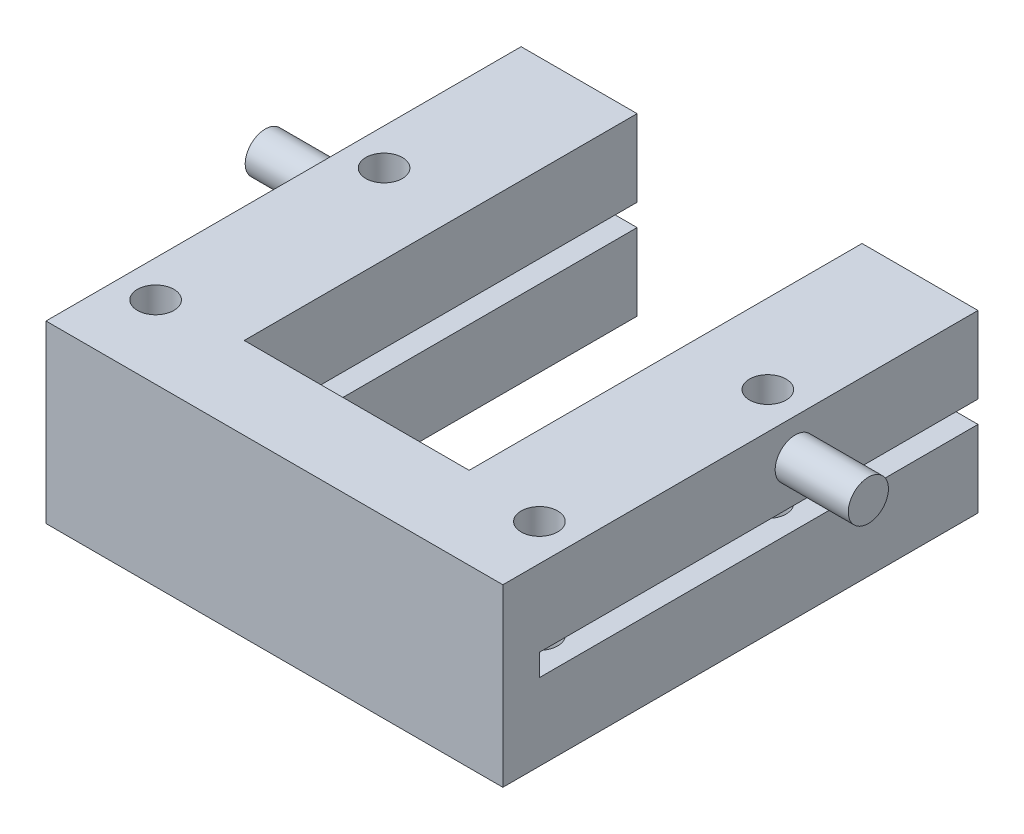
ISO-10303-21;
HEADER;
FILE_DESCRIPTION(('STEP AP214'),'2;1');
FILE_NAME('part.step','',(''),(''),'','','');
FILE_SCHEMA(('AUTOMOTIVE_DESIGN { 1 0 10303 214 1 1 1 1 }'));
ENDSEC;
DATA;
#1=APPLICATION_CONTEXT('core data for automotive mechanical design processes');
#2=APPLICATION_PROTOCOL_DEFINITION('international standard','automotive_design',2000,#1);
#3=PRODUCT_CONTEXT('',#1,'mechanical');
#4=PRODUCT('Part','Part','',(#3));
#5=PRODUCT_RELATED_PRODUCT_CATEGORY('part','',(#4));
#6=PRODUCT_DEFINITION_FORMATION('','',#4);
#7=PRODUCT_DEFINITION_CONTEXT('part definition',#1,'design');
#8=PRODUCT_DEFINITION('design','',#6,#7);
#9=PRODUCT_DEFINITION_SHAPE('','',#8);
#10=(LENGTH_UNIT() NAMED_UNIT(*) SI_UNIT(.MILLI.,.METRE.));
#11=(NAMED_UNIT(*) PLANE_ANGLE_UNIT() SI_UNIT($,.RADIAN.));
#12=(NAMED_UNIT(*) SI_UNIT($,.STERADIAN.) SOLID_ANGLE_UNIT());
#13=UNCERTAINTY_MEASURE_WITH_UNIT(LENGTH_MEASURE(1.E-05),#10,'distance_accuracy_value','');
#14=(GEOMETRIC_REPRESENTATION_CONTEXT(3) GLOBAL_UNCERTAINTY_ASSIGNED_CONTEXT((#13)) GLOBAL_UNIT_ASSIGNED_CONTEXT((#10,
#11,#12)) REPRESENTATION_CONTEXT('',''));
#15=CARTESIAN_POINT('',(0.,0.,0.));
#16=DIRECTION('',(0.,0.,1.));
#17=DIRECTION('',(1.,0.,0.));
#18=AXIS2_PLACEMENT_3D('',#15,#16,#17);
#19=CARTESIAN_POINT('',(4.25,4.2,-2.5));
#20=DIRECTION('',(0.,0.,1.));
#21=DIRECTION('',(1.,0.,0.));
#22=AXIS2_PLACEMENT_3D('',#19,#20,#21);
#23=PLANE('',#22);
#24=DIRECTION('',(0.,1.,0.));
#25=VECTOR('',#24,1.);
#26=CARTESIAN_POINT('',(18.6536328938881,4.2,-2.5));
#27=LINE('',#26,#25);
#28=CARTESIAN_POINT('',(18.6536328938881,0.,-2.5));
#29=VERTEX_POINT('',#28);
#30=CARTESIAN_POINT('',(18.6536328938881,4.2,-2.5));
#31=VERTEX_POINT('',#30);
#32=EDGE_CURVE('E221',#29,#31,#27,.T.);
#33=ORIENTED_EDGE('',*,*,#32,.F.);
#34=DIRECTION('',(1.,0.,0.));
#35=VECTOR('',#34,1.);
#36=CARTESIAN_POINT('',(25.,0.,-2.5));
#37=LINE('',#36,#35);
#38=CARTESIAN_POINT('',(6.34636710611189,0.,-2.5));
#39=VERTEX_POINT('',#38);
#40=EDGE_CURVE('E182',#39,#29,#37,.T.);
#41=ORIENTED_EDGE('',*,*,#40,.F.);
#42=DIRECTION('',(0.,-1.,0.));
#43=VECTOR('',#42,1.);
#44=CARTESIAN_POINT('',(6.34636710611189,4.2,-2.5));
#45=LINE('',#44,#43);
#46=CARTESIAN_POINT('',(6.34636710611189,4.2,-2.5));
#47=VERTEX_POINT('',#46);
#48=EDGE_CURVE('E218',#47,#39,#45,.T.);
#49=ORIENTED_EDGE('',*,*,#48,.F.);
#50=DIRECTION('',(-1.,0.,0.));
#51=VECTOR('',#50,1.);
#52=CARTESIAN_POINT('',(4.25,4.2,-2.5));
#53=LINE('',#52,#51);
#54=EDGE_CURVE('E323',#31,#47,#53,.T.);
#55=ORIENTED_EDGE('',*,*,#54,.F.);
#56=EDGE_LOOP('',(#33,#41,#49,#55));
#57=FACE_BOUND('',#56,.T.);
#58=ADVANCED_FACE('F39',(#57),#23,.F.);
#59=CARTESIAN_POINT('',(2.,4.2,-2.));
#60=DIRECTION('',(0.,-1.,0.));
#61=DIRECTION('',(0.,0.,-1.));
#62=AXIS2_PLACEMENT_3D('',#59,#60,#61);
#63=CYLINDRICAL_SURFACE('',#62,1.);
#64=CARTESIAN_POINT('',(2.,0.,-2.));
#65=DIRECTION('',(0.,-1.,0.));
#66=DIRECTION('',(0.,0.,-1.));
#67=AXIS2_PLACEMENT_3D('',#64,#65,#66);
#68=CIRCLE('',#67,1.);
#69=CARTESIAN_POINT('',(2.,0.,-3.));
#70=VERTEX_POINT('',#69);
#71=EDGE_CURVE('E257',#70,#70,#68,.T.);
#72=ORIENTED_EDGE('',*,*,#71,.T.);
#73=EDGE_LOOP('',(#72));
#74=FACE_BOUND('',#73,.T.);
#75=CARTESIAN_POINT('',(2.,4.2,-2.));
#76=DIRECTION('',(0.,1.,0.));
#77=DIRECTION('',(0.,0.,1.));
#78=AXIS2_PLACEMENT_3D('',#75,#76,#77);
#79=CIRCLE('',#78,1.);
#80=CARTESIAN_POINT('',(2.,4.2,-1.));
#81=VERTEX_POINT('',#80);
#82=EDGE_CURVE('E312',#81,#81,#79,.T.);
#83=ORIENTED_EDGE('',*,*,#82,.T.);
#84=EDGE_LOOP('',(#83));
#85=FACE_BOUND('',#84,.T.);
#86=ADVANCED_FACE('F360',(#74,#85),#63,.F.);
#87=CARTESIAN_POINT('',(23.,4.2,-2.));
#88=DIRECTION('',(0.,-1.,0.));
#89=DIRECTION('',(0.,0.,-1.));
#90=AXIS2_PLACEMENT_3D('',#87,#88,#89);
#91=CYLINDRICAL_SURFACE('',#90,0.999999999999998);
#92=CARTESIAN_POINT('',(23.,0.,-2.));
#93=DIRECTION('',(0.,-1.,0.));
#94=DIRECTION('',(0.,0.,-1.));
#95=AXIS2_PLACEMENT_3D('',#92,#93,#94);
#96=CIRCLE('',#95,0.999999999999998);
#97=CARTESIAN_POINT('',(23.,0.,-3.));
#98=VERTEX_POINT('',#97);
#99=EDGE_CURVE('E254',#98,#98,#96,.T.);
#100=ORIENTED_EDGE('',*,*,#99,.T.);
#101=EDGE_LOOP('',(#100));
#102=FACE_BOUND('',#101,.T.);
#103=CARTESIAN_POINT('',(23.,4.2,-2.));
#104=DIRECTION('',(0.,1.,0.));
#105=DIRECTION('',(0.,0.,-1.));
#106=AXIS2_PLACEMENT_3D('',#103,#104,#105);
#107=CIRCLE('',#106,0.999999999999998);
#108=CARTESIAN_POINT('',(23.,4.2,-3.));
#109=VERTEX_POINT('',#108);
#110=EDGE_CURVE('E309',#109,#109,#107,.T.);
#111=ORIENTED_EDGE('',*,*,#110,.T.);
#112=EDGE_LOOP('',(#111));
#113=FACE_BOUND('',#112,.T.);
#114=ADVANCED_FACE('F372',(#102,#113),#91,.F.);
#115=DIRECTION('',(0.,-1.,0.));
#116=VECTOR('',#115,1.);
#117=CARTESIAN_POINT('',(6.34636710611189,-5.4,-2.5));
#118=LINE('',#117,#116);
#119=CARTESIAN_POINT('',(6.34636710611189,-1.2,-2.5));
#120=VERTEX_POINT('',#119);
#121=CARTESIAN_POINT('',(6.34636710611189,-5.4,-2.5));
#122=VERTEX_POINT('',#121);
#123=EDGE_CURVE('E209',#120,#122,#118,.T.);
#124=ORIENTED_EDGE('',*,*,#123,.F.);
#125=DIRECTION('',(-1.,0.,0.));
#126=VECTOR('',#125,1.);
#127=CARTESIAN_POINT('',(25.,-1.2,-2.5));
#128=LINE('',#127,#126);
#129=CARTESIAN_POINT('',(18.6536328938881,-1.2,-2.5));
#130=VERTEX_POINT('',#129);
#131=EDGE_CURVE('E184',#130,#120,#128,.T.);
#132=ORIENTED_EDGE('',*,*,#131,.F.);
#133=DIRECTION('',(0.,1.,0.));
#134=VECTOR('',#133,1.);
#135=CARTESIAN_POINT('',(18.6536328938881,-5.4,-2.5));
#136=LINE('',#135,#134);
#137=CARTESIAN_POINT('',(18.6536328938881,-5.4,-2.5));
#138=VERTEX_POINT('',#137);
#139=EDGE_CURVE('E195',#138,#130,#136,.T.);
#140=ORIENTED_EDGE('',*,*,#139,.F.);
#141=DIRECTION('',(-1.,0.,0.));
#142=VECTOR('',#141,1.);
#143=CARTESIAN_POINT('',(4.25,-5.4,-2.5));
#144=LINE('',#143,#142);
#145=EDGE_CURVE('E285',#138,#122,#144,.T.);
#146=ORIENTED_EDGE('',*,*,#145,.T.);
#147=EDGE_LOOP('',(#124,#132,#140,#146));
#148=FACE_BOUND('',#147,.T.);
#149=ADVANCED_FACE('F368',(#148),#23,.F.);
#150=CARTESIAN_POINT('',(0.,4.2,0.));
#151=DIRECTION('',(1.,0.,0.));
#152=DIRECTION('',(0.,0.,-1.));
#153=AXIS2_PLACEMENT_3D('',#150,#151,#152);
#154=PLANE('',#153);
#155=DIRECTION('',(0.,0.,1.));
#156=VECTOR('',#155,1.);
#157=CARTESIAN_POINT('',(0.,0.,-49.0287834302828));
#158=LINE('',#157,#156);
#159=CARTESIAN_POINT('',(0.,0.,-24.));
#160=VERTEX_POINT('',#159);
#161=CARTESIAN_POINT('',(0.,0.,0.));
#162=VERTEX_POINT('',#161);
#163=EDGE_CURVE('E240',#160,#162,#158,.T.);
#164=ORIENTED_EDGE('',*,*,#163,.T.);
#165=DIRECTION('',(0.,1.,0.));
#166=VECTOR('',#165,1.);
#167=CARTESIAN_POINT('',(0.,0.,0.));
#168=LINE('',#167,#166);
#169=CARTESIAN_POINT('',(0.,-1.2,0.));
#170=VERTEX_POINT('',#169);
#171=EDGE_CURVE('E176',#170,#162,#168,.T.);
#172=ORIENTED_EDGE('',*,*,#171,.F.);
#173=DIRECTION('',(0.,0.,1.));
#174=VECTOR('',#173,1.);
#175=CARTESIAN_POINT('',(0.,-1.2,-49.0287834302828));
#176=LINE('',#175,#174);
#177=CARTESIAN_POINT('',(0.,-1.2,-24.));
#178=VERTEX_POINT('',#177);
#179=EDGE_CURVE('E165',#178,#170,#176,.T.);
#180=ORIENTED_EDGE('',*,*,#179,.F.);
#181=DIRECTION('',(0.,-1.,0.));
#182=VECTOR('',#181,1.);
#183=CARTESIAN_POINT('',(0.,4.2,-24.));
#184=LINE('',#183,#182);
#185=CARTESIAN_POINT('',(0.,-5.4,-24.));
#186=VERTEX_POINT('',#185);
#187=EDGE_CURVE('E327',#178,#186,#184,.T.);
#188=ORIENTED_EDGE('',*,*,#187,.T.);
#189=DIRECTION('',(0.,0.,1.));
#190=VECTOR('',#189,1.);
#191=CARTESIAN_POINT('',(0.,-5.4,0.));
#192=LINE('',#191,#190);
#193=CARTESIAN_POINT('',(0.,-5.4,2.));
#194=VERTEX_POINT('',#193);
#195=EDGE_CURVE('E278',#186,#194,#192,.T.);
#196=ORIENTED_EDGE('',*,*,#195,.T.);
#197=DIRECTION('',(0.,-1.,0.));
#198=VECTOR('',#197,1.);
#199=CARTESIAN_POINT('',(0.,4.2,2.));
#200=LINE('',#199,#198);
#201=CARTESIAN_POINT('',(0.,4.2,2.));
#202=VERTEX_POINT('',#201);
#203=EDGE_CURVE('E290',#202,#194,#200,.T.);
#204=ORIENTED_EDGE('',*,*,#203,.F.);
#205=DIRECTION('',(0.,0.,1.));
#206=VECTOR('',#205,1.);
#207=CARTESIAN_POINT('',(0.,4.2,0.));
#208=LINE('',#207,#206);
#209=CARTESIAN_POINT('',(0.,4.2,-24.));
#210=VERTEX_POINT('',#209);
#211=EDGE_CURVE('E318',#210,#202,#208,.T.);
#212=ORIENTED_EDGE('',*,*,#211,.F.);
#213=EDGE_CURVE('E328',#210,#160,#184,.T.);
#214=ORIENTED_EDGE('',*,*,#213,.T.);
#215=EDGE_LOOP('',(#164,#172,#180,#188,#196,#204,#212,#214));
#216=FACE_BOUND('',#215,.T.);
#217=CARTESIAN_POINT('',(0.,2.2,-14.));
#218=DIRECTION('',(-1.,0.,0.));
#219=DIRECTION('',(0.,0.,1.));
#220=AXIS2_PLACEMENT_3D('',#217,#218,#219);
#221=CIRCLE('',#220,1.1);
#222=CARTESIAN_POINT('',(0.,2.2,-12.9));
#223=VERTEX_POINT('',#222);
#224=EDGE_CURVE('E11',#223,#223,#221,.T.);
#225=ORIENTED_EDGE('',*,*,#224,.F.);
#226=EDGE_LOOP('',(#225));
#227=FACE_BOUND('',#226,.T.);
#228=ADVANCED_FACE('F41',(#216,#227),#154,.F.);
#229=CARTESIAN_POINT('',(25.,4.2,0.));
#230=DIRECTION('',(-1.,0.,0.));
#231=DIRECTION('',(0.,0.,1.));
#232=AXIS2_PLACEMENT_3D('',#229,#230,#231);
#233=PLANE('',#232);
#234=CARTESIAN_POINT('',(25.,2.2,-14.));
#235=DIRECTION('',(-1.,0.,0.));
#236=DIRECTION('',(0.,0.,1.));
#237=AXIS2_PLACEMENT_3D('',#234,#235,#236);
#238=CIRCLE('',#237,1.1);
#239=CARTESIAN_POINT('',(25.,2.2,-12.9));
#240=VERTEX_POINT('',#239);
#241=EDGE_CURVE('E297',#240,#240,#238,.T.);
#242=ORIENTED_EDGE('',*,*,#241,.T.);
#243=EDGE_LOOP('',(#242));
#244=FACE_BOUND('',#243,.T.);
#245=DIRECTION('',(0.,-1.,0.));
#246=VECTOR('',#245,1.);
#247=CARTESIAN_POINT('',(25.,0.,0.));
#248=LINE('',#247,#246);
#249=CARTESIAN_POINT('',(25.,0.,0.));
#250=VERTEX_POINT('',#249);
#251=CARTESIAN_POINT('',(25.,-1.2,0.));
#252=VERTEX_POINT('',#251);
#253=EDGE_CURVE('E159',#250,#252,#248,.T.);
#254=ORIENTED_EDGE('',*,*,#253,.F.);
#255=DIRECTION('',(0.,0.,1.));
#256=VECTOR('',#255,1.);
#257=CARTESIAN_POINT('',(25.,0.,-49.0287834302828));
#258=LINE('',#257,#256);
#259=CARTESIAN_POINT('',(25.,0.,-24.));
#260=VERTEX_POINT('',#259);
#261=EDGE_CURVE('E227',#260,#250,#258,.T.);
#262=ORIENTED_EDGE('',*,*,#261,.F.);
#263=DIRECTION('',(0.,-1.,0.));
#264=VECTOR('',#263,1.);
#265=CARTESIAN_POINT('',(25.,4.2,-24.));
#266=LINE('',#265,#264);
#267=CARTESIAN_POINT('',(25.,4.2,-24.));
#268=VERTEX_POINT('',#267);
#269=EDGE_CURVE('E48',#268,#260,#266,.T.);
#270=ORIENTED_EDGE('',*,*,#269,.F.);
#271=DIRECTION('',(0.,0.,-1.));
#272=VECTOR('',#271,1.);
#273=CARTESIAN_POINT('',(25.,4.2,0.));
#274=LINE('',#273,#272);
#275=CARTESIAN_POINT('',(25.,4.2,2.));
#276=VERTEX_POINT('',#275);
#277=EDGE_CURVE('E63',#276,#268,#274,.T.);
#278=ORIENTED_EDGE('',*,*,#277,.F.);
#279=DIRECTION('',(0.,1.,0.));
#280=VECTOR('',#279,1.);
#281=CARTESIAN_POINT('',(25.,4.2,2.));
#282=LINE('',#281,#280);
#283=CARTESIAN_POINT('',(25.,-5.4,2.));
#284=VERTEX_POINT('',#283);
#285=EDGE_CURVE('E292',#284,#276,#282,.T.);
#286=ORIENTED_EDGE('',*,*,#285,.F.);
#287=DIRECTION('',(0.,0.,-1.));
#288=VECTOR('',#287,1.);
#289=CARTESIAN_POINT('',(25.,-5.4,0.));
#290=LINE('',#289,#288);
#291=CARTESIAN_POINT('',(25.,-5.4,-24.));
#292=VERTEX_POINT('',#291);
#293=EDGE_CURVE('E281',#284,#292,#290,.T.);
#294=ORIENTED_EDGE('',*,*,#293,.T.);
#295=CARTESIAN_POINT('',(25.,-1.2,-24.));
#296=VERTEX_POINT('',#295);
#297=EDGE_CURVE('E161',#296,#292,#266,.T.);
#298=ORIENTED_EDGE('',*,*,#297,.F.);
#299=DIRECTION('',(0.,0.,1.));
#300=VECTOR('',#299,1.);
#301=CARTESIAN_POINT('',(25.,-1.2,-49.0287834302828));
#302=LINE('',#301,#300);
#303=EDGE_CURVE('E154',#296,#252,#302,.T.);
#304=ORIENTED_EDGE('',*,*,#303,.T.);
#305=EDGE_LOOP('',(#254,#262,#270,#278,#286,#294,#298,#304));
#306=FACE_BOUND('',#305,.T.);
#307=ADVANCED_FACE('F156',(#244,#306),#233,.F.);
#308=CARTESIAN_POINT('',(20.75,4.2,-24.));
#309=DIRECTION('',(0.,0.,1.));
#310=DIRECTION('',(1.,0.,0.));
#311=AXIS2_PLACEMENT_3D('',#308,#309,#310);
#312=PLANE('',#311);
#313=DIRECTION('',(-1.,0.,0.));
#314=VECTOR('',#313,1.);
#315=CARTESIAN_POINT('',(25.,0.,-24.));
#316=LINE('',#315,#314);
#317=CARTESIAN_POINT('',(18.6536328938881,0.,-24.));
#318=VERTEX_POINT('',#317);
#319=EDGE_CURVE('E243',#260,#318,#316,.T.);
#320=ORIENTED_EDGE('',*,*,#319,.T.);
#321=DIRECTION('',(0.,-1.,0.));
#322=VECTOR('',#321,1.);
#323=CARTESIAN_POINT('',(18.6536328938881,4.2,-24.));
#324=LINE('',#323,#322);
#325=CARTESIAN_POINT('',(18.6536328938881,4.2,-24.));
#326=VERTEX_POINT('',#325);
#327=EDGE_CURVE('E224',#326,#318,#324,.T.);
#328=ORIENTED_EDGE('',*,*,#327,.F.);
#329=DIRECTION('',(-1.,0.,0.));
#330=VECTOR('',#329,1.);
#331=CARTESIAN_POINT('',(20.75,4.2,-24.));
#332=LINE('',#331,#330);
#333=EDGE_CURVE('E321',#268,#326,#332,.T.);
#334=ORIENTED_EDGE('',*,*,#333,.F.);
#335=ORIENTED_EDGE('',*,*,#269,.T.);
#336=EDGE_LOOP('',(#320,#328,#334,#335));
#337=FACE_BOUND('',#336,.T.);
#338=ADVANCED_FACE('F414',(#337),#312,.F.);
#339=DIRECTION('',(1.,0.,0.));
#340=VECTOR('',#339,1.);
#341=CARTESIAN_POINT('',(25.,-1.2,-24.));
#342=LINE('',#341,#340);
#343=CARTESIAN_POINT('',(18.6536328938881,-1.2,-24.));
#344=VERTEX_POINT('',#343);
#345=EDGE_CURVE('E238',#344,#296,#342,.T.);
#346=ORIENTED_EDGE('',*,*,#345,.T.);
#347=ORIENTED_EDGE('',*,*,#297,.T.);
#348=DIRECTION('',(-1.,0.,0.));
#349=VECTOR('',#348,1.);
#350=CARTESIAN_POINT('',(20.75,-5.4,-24.));
#351=LINE('',#350,#349);
#352=CARTESIAN_POINT('',(18.6536328938881,-5.4,-24.));
#353=VERTEX_POINT('',#352);
#354=EDGE_CURVE('E283',#292,#353,#351,.T.);
#355=ORIENTED_EDGE('',*,*,#354,.T.);
#356=DIRECTION('',(0.,-1.,0.));
#357=VECTOR('',#356,1.);
#358=CARTESIAN_POINT('',(18.6536328938881,-5.4,-24.));
#359=LINE('',#358,#357);
#360=EDGE_CURVE('E189',#344,#353,#359,.T.);
#361=ORIENTED_EDGE('',*,*,#360,.F.);
#362=EDGE_LOOP('',(#346,#347,#355,#361));
#363=FACE_BOUND('',#362,.T.);
#364=ADVANCED_FACE('F434',(#363),#312,.F.);
#365=CARTESIAN_POINT('',(0.,4.2,-24.));
#366=DIRECTION('',(0.,0.,1.));
#367=DIRECTION('',(1.,0.,0.));
#368=AXIS2_PLACEMENT_3D('',#365,#366,#367);
#369=PLANE('',#368);
#370=CARTESIAN_POINT('',(6.34636710611189,0.,-24.));
#371=VERTEX_POINT('',#370);
#372=EDGE_CURVE('E164',#371,#160,#316,.T.);
#373=ORIENTED_EDGE('',*,*,#372,.T.);
#374=ORIENTED_EDGE('',*,*,#213,.F.);
#375=DIRECTION('',(-1.,0.,0.));
#376=VECTOR('',#375,1.);
#377=CARTESIAN_POINT('',(0.,4.2,-24.));
#378=LINE('',#377,#376);
#379=CARTESIAN_POINT('',(6.34636710611189,4.2,-24.));
#380=VERTEX_POINT('',#379);
#381=EDGE_CURVE('E56',#380,#210,#378,.T.);
#382=ORIENTED_EDGE('',*,*,#381,.F.);
#383=DIRECTION('',(0.,1.,0.));
#384=VECTOR('',#383,1.);
#385=CARTESIAN_POINT('',(6.34636710611189,4.2,-24.));
#386=LINE('',#385,#384);
#387=EDGE_CURVE('E212',#371,#380,#386,.T.);
#388=ORIENTED_EDGE('',*,*,#387,.F.);
#389=EDGE_LOOP('',(#373,#374,#382,#388));
#390=FACE_BOUND('',#389,.T.);
#391=ADVANCED_FACE('F427',(#390),#369,.F.);
#392=CARTESIAN_POINT('',(6.34636710611189,-1.2,-24.));
#393=VERTEX_POINT('',#392);
#394=EDGE_CURVE('E235',#178,#393,#342,.T.);
#395=ORIENTED_EDGE('',*,*,#394,.T.);
#396=DIRECTION('',(0.,1.,0.));
#397=VECTOR('',#396,1.);
#398=CARTESIAN_POINT('',(6.34636710611189,-5.4,-24.));
#399=LINE('',#398,#397);
#400=CARTESIAN_POINT('',(6.34636710611189,-5.4,-24.));
#401=VERTEX_POINT('',#400);
#402=EDGE_CURVE('E198',#401,#393,#399,.T.);
#403=ORIENTED_EDGE('',*,*,#402,.F.);
#404=DIRECTION('',(-1.,0.,0.));
#405=VECTOR('',#404,1.);
#406=CARTESIAN_POINT('',(0.,-5.4,-24.));
#407=LINE('',#406,#405);
#408=EDGE_CURVE('E287',#401,#186,#407,.T.);
#409=ORIENTED_EDGE('',*,*,#408,.T.);
#410=ORIENTED_EDGE('',*,*,#187,.F.);
#411=EDGE_LOOP('',(#395,#403,#409,#410));
#412=FACE_BOUND('',#411,.T.);
#413=ADVANCED_FACE('F361',(#412),#369,.F.);
#414=CARTESIAN_POINT('',(2.,4.2,-14.5));
#415=DIRECTION('',(0.,-1.,0.));
#416=DIRECTION('',(0.,0.,-1.));
#417=AXIS2_PLACEMENT_3D('',#414,#415,#416);
#418=CYLINDRICAL_SURFACE('',#417,1.);
#419=CARTESIAN_POINT('',(2.,4.2,-14.5));
#420=DIRECTION('',(0.,1.,0.));
#421=DIRECTION('',(0.,0.,1.));
#422=AXIS2_PLACEMENT_3D('',#419,#420,#421);
#423=CIRCLE('',#422,1.);
#424=CARTESIAN_POINT('',(2.,4.2,-13.5));
#425=VERTEX_POINT('',#424);
#426=EDGE_CURVE('E315',#425,#425,#423,.T.);
#427=ORIENTED_EDGE('',*,*,#426,.T.);
#428=EDGE_LOOP('',(#427));
#429=FACE_BOUND('',#428,.T.);
#430=CARTESIAN_POINT('',(2.,0.,-14.5));
#431=DIRECTION('',(0.,-1.,0.));
#432=DIRECTION('',(0.,0.,-1.));
#433=AXIS2_PLACEMENT_3D('',#430,#431,#432);
#434=CIRCLE('',#433,1.);
#435=CARTESIAN_POINT('',(2.,0.,-15.5));
#436=VERTEX_POINT('',#435);
#437=EDGE_CURVE('E260',#436,#436,#434,.T.);
#438=ORIENTED_EDGE('',*,*,#437,.T.);
#439=EDGE_LOOP('',(#438));
#440=FACE_BOUND('',#439,.T.);
#441=ADVANCED_FACE('F350',(#429,#440),#418,.F.);
#442=CARTESIAN_POINT('',(2.,-5.4,-14.5));
#443=DIRECTION('',(0.,1.,0.));
#444=DIRECTION('',(0.,0.,1.));
#445=AXIS2_PLACEMENT_3D('',#442,#443,#444);
#446=CIRCLE('',#445,1.);
#447=CARTESIAN_POINT('',(2.,-5.4,-13.5));
#448=VERTEX_POINT('',#447);
#449=EDGE_CURVE('E275',#448,#448,#446,.T.);
#450=ORIENTED_EDGE('',*,*,#449,.F.);
#451=EDGE_LOOP('',(#450));
#452=FACE_BOUND('',#451,.T.);
#453=CARTESIAN_POINT('',(2.,-1.2,-14.5));
#454=DIRECTION('',(0.,1.,0.));
#455=DIRECTION('',(0.,0.,1.));
#456=AXIS2_PLACEMENT_3D('',#453,#454,#455);
#457=CIRCLE('',#456,1.);
#458=CARTESIAN_POINT('',(2.,-1.2,-13.5));
#459=VERTEX_POINT('',#458);
#460=EDGE_CURVE('E251',#459,#459,#457,.T.);
#461=ORIENTED_EDGE('',*,*,#460,.T.);
#462=EDGE_LOOP('',(#461));
#463=FACE_BOUND('',#462,.T.);
#464=ADVANCED_FACE('F347',(#452,#463),#418,.F.);
#465=CARTESIAN_POINT('',(2.,-1.2,-2.));
#466=DIRECTION('',(0.,1.,0.));
#467=DIRECTION('',(0.,0.,1.));
#468=AXIS2_PLACEMENT_3D('',#465,#466,#467);
#469=CIRCLE('',#468,1.);
#470=CARTESIAN_POINT('',(2.,-1.2,-1.));
#471=VERTEX_POINT('',#470);
#472=EDGE_CURVE('E248',#471,#471,#469,.T.);
#473=ORIENTED_EDGE('',*,*,#472,.T.);
#474=EDGE_LOOP('',(#473));
#475=FACE_BOUND('',#474,.T.);
#476=CARTESIAN_POINT('',(2.,-5.4,-2.));
#477=DIRECTION('',(0.,1.,0.));
#478=DIRECTION('',(0.,0.,1.));
#479=AXIS2_PLACEMENT_3D('',#476,#477,#478);
#480=CIRCLE('',#479,1.);
#481=CARTESIAN_POINT('',(2.,-5.4,-1.));
#482=VERTEX_POINT('',#481);
#483=EDGE_CURVE('E272',#482,#482,#480,.T.);
#484=ORIENTED_EDGE('',*,*,#483,.F.);
#485=EDGE_LOOP('',(#484));
#486=FACE_BOUND('',#485,.T.);
#487=ADVANCED_FACE('F349',(#475,#486),#63,.F.);
#488=CARTESIAN_POINT('',(23.,-1.2,-2.));
#489=DIRECTION('',(0.,1.,0.));
#490=DIRECTION('',(0.,0.,1.));
#491=AXIS2_PLACEMENT_3D('',#488,#489,#490);
#492=CIRCLE('',#491,0.999999999999998);
#493=CARTESIAN_POINT('',(23.,-1.2,-1.));
#494=VERTEX_POINT('',#493);
#495=EDGE_CURVE('E245',#494,#494,#492,.T.);
#496=ORIENTED_EDGE('',*,*,#495,.T.);
#497=EDGE_LOOP('',(#496));
#498=FACE_BOUND('',#497,.T.);
#499=CARTESIAN_POINT('',(23.,-5.4,-2.));
#500=DIRECTION('',(0.,1.,0.));
#501=DIRECTION('',(0.,0.,-1.));
#502=AXIS2_PLACEMENT_3D('',#499,#500,#501);
#503=CIRCLE('',#502,0.999999999999998);
#504=CARTESIAN_POINT('',(23.,-5.4,-3.));
#505=VERTEX_POINT('',#504);
#506=EDGE_CURVE('E269',#505,#505,#503,.T.);
#507=ORIENTED_EDGE('',*,*,#506,.F.);
#508=EDGE_LOOP('',(#507));
#509=FACE_BOUND('',#508,.T.);
#510=ADVANCED_FACE('F357',(#498,#509),#91,.F.);
#511=CARTESIAN_POINT('',(23.,4.2,-14.5));
#512=DIRECTION('',(0.,-1.,0.));
#513=DIRECTION('',(0.,0.,-1.));
#514=AXIS2_PLACEMENT_3D('',#511,#512,#513);
#515=CYLINDRICAL_SURFACE('',#514,0.999999999999998);
#516=CARTESIAN_POINT('',(23.,4.2,-14.5));
#517=DIRECTION('',(0.,1.,0.));
#518=DIRECTION('',(0.,0.,-1.));
#519=AXIS2_PLACEMENT_3D('',#516,#517,#518);
#520=CIRCLE('',#519,0.999999999999998);
#521=CARTESIAN_POINT('',(23.,4.2,-15.5));
#522=VERTEX_POINT('',#521);
#523=EDGE_CURVE('E305',#522,#522,#520,.T.);
#524=ORIENTED_EDGE('',*,*,#523,.T.);
#525=EDGE_LOOP('',(#524));
#526=FACE_BOUND('',#525,.T.);
#527=CARTESIAN_POINT('',(23.,0.,-14.5));
#528=DIRECTION('',(0.,-1.,0.));
#529=DIRECTION('',(0.,0.,-1.));
#530=AXIS2_PLACEMENT_3D('',#527,#528,#529);
#531=CIRCLE('',#530,0.999999999999998);
#532=CARTESIAN_POINT('',(23.,0.,-15.5));
#533=VERTEX_POINT('',#532);
#534=EDGE_CURVE('E43',#533,#533,#531,.T.);
#535=ORIENTED_EDGE('',*,*,#534,.T.);
#536=EDGE_LOOP('',(#535));
#537=FACE_BOUND('',#536,.T.);
#538=ADVANCED_FACE('F466',(#526,#537),#515,.F.);
#539=CARTESIAN_POINT('',(23.,-5.4,-14.5));
#540=DIRECTION('',(0.,1.,0.));
#541=DIRECTION('',(0.,0.,-1.));
#542=AXIS2_PLACEMENT_3D('',#539,#540,#541);
#543=CIRCLE('',#542,0.999999999999998);
#544=CARTESIAN_POINT('',(23.,-5.4,-15.5));
#545=VERTEX_POINT('',#544);
#546=EDGE_CURVE('E266',#545,#545,#543,.T.);
#547=ORIENTED_EDGE('',*,*,#546,.F.);
#548=EDGE_LOOP('',(#547));
#549=FACE_BOUND('',#548,.T.);
#550=CARTESIAN_POINT('',(23.,-1.2,-14.5));
#551=DIRECTION('',(0.,1.,0.));
#552=DIRECTION('',(0.,0.,1.));
#553=AXIS2_PLACEMENT_3D('',#550,#551,#552);
#554=CIRCLE('',#553,0.999999999999998);
#555=CARTESIAN_POINT('',(23.,-1.2,-13.5));
#556=VERTEX_POINT('',#555);
#557=EDGE_CURVE('E237',#556,#556,#554,.T.);
#558=ORIENTED_EDGE('',*,*,#557,.T.);
#559=EDGE_LOOP('',(#558));
#560=FACE_BOUND('',#559,.T.);
#561=ADVANCED_FACE('F335',(#549,#560),#515,.F.);
#562=CARTESIAN_POINT('',(0.,4.2,0.));
#563=DIRECTION('',(0.,-1.,0.));
#564=DIRECTION('',(0.,0.,-1.));
#565=AXIS2_PLACEMENT_3D('',#562,#563,#564);
#566=PLANE('',#565);
#567=ORIENTED_EDGE('',*,*,#54,.T.);
#568=DIRECTION('',(0.,0.,1.));
#569=VECTOR('',#568,1.);
#570=CARTESIAN_POINT('',(6.34636710611189,4.2,-28.6941191978462));
#571=LINE('',#570,#569);
#572=EDGE_CURVE('E213',#380,#47,#571,.T.);
#573=ORIENTED_EDGE('',*,*,#572,.F.);
#574=ORIENTED_EDGE('',*,*,#381,.T.);
#575=ORIENTED_EDGE('',*,*,#211,.T.);
#576=DIRECTION('',(-1.,0.,0.));
#577=VECTOR('',#576,1.);
#578=CARTESIAN_POINT('',(0.,4.2,2.));
#579=LINE('',#578,#577);
#580=EDGE_CURVE('E294',#276,#202,#579,.T.);
#581=ORIENTED_EDGE('',*,*,#580,.F.);
#582=ORIENTED_EDGE('',*,*,#277,.T.);
#583=ORIENTED_EDGE('',*,*,#333,.T.);
#584=DIRECTION('',(0.,0.,1.));
#585=VECTOR('',#584,1.);
#586=CARTESIAN_POINT('',(18.6536328938881,4.2,-28.6941191978462));
#587=LINE('',#586,#585);
#588=EDGE_CURVE('E231',#326,#31,#587,.T.);
#589=ORIENTED_EDGE('',*,*,#588,.T.);
#590=EDGE_LOOP('',(#567,#573,#574,#575,#581,#582,#583,#589));
#591=FACE_BOUND('',#590,.T.);
#592=ORIENTED_EDGE('',*,*,#426,.F.);
#593=EDGE_LOOP('',(#592));
#594=FACE_BOUND('',#593,.T.);
#595=ORIENTED_EDGE('',*,*,#82,.F.);
#596=EDGE_LOOP('',(#595));
#597=FACE_BOUND('',#596,.T.);
#598=ORIENTED_EDGE('',*,*,#110,.F.);
#599=EDGE_LOOP('',(#598));
#600=FACE_BOUND('',#599,.T.);
#601=ORIENTED_EDGE('',*,*,#523,.F.);
#602=EDGE_LOOP('',(#601));
#603=FACE_BOUND('',#602,.T.);
#604=ADVANCED_FACE('F417',(#591,#594,#597,#600,#603),#566,.F.);
#605=CARTESIAN_POINT('',(-4.,2.2,-14.));
#606=DIRECTION('',(1.,0.,0.));
#607=DIRECTION('',(0.,0.,-1.));
#608=AXIS2_PLACEMENT_3D('',#605,#606,#607);
#609=CYLINDRICAL_SURFACE('',#608,1.1);
#610=CARTESIAN_POINT('',(-4.,2.2,-14.));
#611=DIRECTION('',(-1.,0.,0.));
#612=DIRECTION('',(0.,0.,1.));
#613=AXIS2_PLACEMENT_3D('',#610,#611,#612);
#614=CIRCLE('',#613,1.1);
#615=CARTESIAN_POINT('',(-4.,2.2,-12.9));
#616=VERTEX_POINT('',#615);
#617=EDGE_CURVE('E301',#616,#616,#614,.T.);
#618=ORIENTED_EDGE('',*,*,#617,.F.);
#619=EDGE_LOOP('',(#618));
#620=FACE_BOUND('',#619,.T.);
#621=ORIENTED_EDGE('',*,*,#224,.T.);
#622=EDGE_LOOP('',(#621));
#623=FACE_BOUND('',#622,.T.);
#624=ADVANCED_FACE('F458',(#620,#623),#609,.T.);
#625=CARTESIAN_POINT('',(-4.,2.2,-14.));
#626=DIRECTION('',(-1.,0.,0.));
#627=DIRECTION('',(0.,0.,1.));
#628=AXIS2_PLACEMENT_3D('',#625,#626,#627);
#629=PLANE('',#628);
#630=ORIENTED_EDGE('',*,*,#617,.T.);
#631=EDGE_LOOP('',(#630));
#632=FACE_BOUND('',#631,.T.);
#633=ADVANCED_FACE('F449',(#632),#629,.T.);
#634=CARTESIAN_POINT('',(29.,2.2,-14.));
#635=DIRECTION('',(-1.,0.,0.));
#636=DIRECTION('',(0.,0.,1.));
#637=AXIS2_PLACEMENT_3D('',#634,#635,#636);
#638=CYLINDRICAL_SURFACE('',#637,1.1);
#639=CARTESIAN_POINT('',(29.,2.2,-14.));
#640=DIRECTION('',(-1.,0.,0.));
#641=DIRECTION('',(0.,0.,1.));
#642=AXIS2_PLACEMENT_3D('',#639,#640,#641);
#643=CIRCLE('',#642,1.1);
#644=CARTESIAN_POINT('',(29.,2.2,-12.9));
#645=VERTEX_POINT('',#644);
#646=EDGE_CURVE('E298',#645,#645,#643,.T.);
#647=ORIENTED_EDGE('',*,*,#646,.T.);
#648=EDGE_LOOP('',(#647));
#649=FACE_BOUND('',#648,.T.);
#650=ORIENTED_EDGE('',*,*,#241,.F.);
#651=EDGE_LOOP('',(#650));
#652=FACE_BOUND('',#651,.T.);
#653=ADVANCED_FACE('F446',(#649,#652),#638,.T.);
#654=CARTESIAN_POINT('',(29.,2.2,-14.));
#655=DIRECTION('',(1.,0.,0.));
#656=DIRECTION('',(0.,0.,1.));
#657=AXIS2_PLACEMENT_3D('',#654,#655,#656);
#658=PLANE('',#657);
#659=ORIENTED_EDGE('',*,*,#646,.F.);
#660=EDGE_LOOP('',(#659));
#661=FACE_BOUND('',#660,.T.);
#662=ADVANCED_FACE('F448',(#661),#658,.T.);
#663=CARTESIAN_POINT('',(0.,0.,2.));
#664=DIRECTION('',(0.,0.,1.));
#665=DIRECTION('',(1.,0.,0.));
#666=AXIS2_PLACEMENT_3D('',#663,#664,#665);
#667=PLANE('',#666);
#668=ORIENTED_EDGE('',*,*,#285,.T.);
#669=ORIENTED_EDGE('',*,*,#580,.T.);
#670=ORIENTED_EDGE('',*,*,#203,.T.);
#671=DIRECTION('',(-1.,0.,0.));
#672=VECTOR('',#671,1.);
#673=CARTESIAN_POINT('',(0.,-5.4,2.));
#674=LINE('',#673,#672);
#675=EDGE_CURVE('E263',#284,#194,#674,.T.);
#676=ORIENTED_EDGE('',*,*,#675,.F.);
#677=EDGE_LOOP('',(#668,#669,#670,#676));
#678=FACE_BOUND('',#677,.T.);
#679=ADVANCED_FACE('F430',(#678),#667,.T.);
#680=CARTESIAN_POINT('',(0.,-5.4,0.));
#681=DIRECTION('',(0.,-1.,0.));
#682=DIRECTION('',(0.,0.,-1.));
#683=AXIS2_PLACEMENT_3D('',#680,#681,#682);
#684=PLANE('',#683);
#685=ORIENTED_EDGE('',*,*,#145,.F.);
#686=DIRECTION('',(0.,0.,1.));
#687=VECTOR('',#686,1.);
#688=CARTESIAN_POINT('',(18.6536328938881,-5.4,-28.6941191978462));
#689=LINE('',#688,#687);
#690=EDGE_CURVE('E191',#353,#138,#689,.T.);
#691=ORIENTED_EDGE('',*,*,#690,.F.);
#692=ORIENTED_EDGE('',*,*,#354,.F.);
#693=ORIENTED_EDGE('',*,*,#293,.F.);
#694=ORIENTED_EDGE('',*,*,#675,.T.);
#695=ORIENTED_EDGE('',*,*,#195,.F.);
#696=ORIENTED_EDGE('',*,*,#408,.F.);
#697=DIRECTION('',(0.,0.,1.));
#698=VECTOR('',#697,1.);
#699=CARTESIAN_POINT('',(6.34636710611189,-5.4,-28.6941191978462));
#700=LINE('',#699,#698);
#701=EDGE_CURVE('E206',#401,#122,#700,.T.);
#702=ORIENTED_EDGE('',*,*,#701,.T.);
#703=EDGE_LOOP('',(#685,#691,#692,#693,#694,#695,#696,#702));
#704=FACE_BOUND('',#703,.T.);
#705=ORIENTED_EDGE('',*,*,#546,.T.);
#706=EDGE_LOOP('',(#705));
#707=FACE_BOUND('',#706,.T.);
#708=ORIENTED_EDGE('',*,*,#506,.T.);
#709=EDGE_LOOP('',(#708));
#710=FACE_BOUND('',#709,.T.);
#711=ORIENTED_EDGE('',*,*,#483,.T.);
#712=EDGE_LOOP('',(#711));
#713=FACE_BOUND('',#712,.T.);
#714=ORIENTED_EDGE('',*,*,#449,.T.);
#715=EDGE_LOOP('',(#714));
#716=FACE_BOUND('',#715,.T.);
#717=ADVANCED_FACE('F400',(#704,#707,#710,#713,#716),#684,.T.);
#718=CARTESIAN_POINT('',(25.,0.,-49.0287834302828));
#719=DIRECTION('',(0.,-1.,0.));
#720=DIRECTION('',(0.,0.,-1.));
#721=AXIS2_PLACEMENT_3D('',#718,#719,#720);
#722=PLANE('',#721);
#723=ORIENTED_EDGE('',*,*,#99,.F.);
#724=EDGE_LOOP('',(#723));
#725=FACE_BOUND('',#724,.T.);
#726=ORIENTED_EDGE('',*,*,#534,.F.);
#727=EDGE_LOOP('',(#726));
#728=FACE_BOUND('',#727,.T.);
#729=ORIENTED_EDGE('',*,*,#40,.T.);
#730=DIRECTION('',(0.,0.,1.));
#731=VECTOR('',#730,1.);
#732=CARTESIAN_POINT('',(18.6536328938881,0.,-28.6941191978462));
#733=LINE('',#732,#731);
#734=EDGE_CURVE('E228',#318,#29,#733,.T.);
#735=ORIENTED_EDGE('',*,*,#734,.F.);
#736=ORIENTED_EDGE('',*,*,#319,.F.);
#737=ORIENTED_EDGE('',*,*,#261,.T.);
#738=DIRECTION('',(1.,0.,0.));
#739=VECTOR('',#738,1.);
#740=CARTESIAN_POINT('',(25.,0.,0.));
#741=LINE('',#740,#739);
#742=EDGE_CURVE('E181',#162,#250,#741,.T.);
#743=ORIENTED_EDGE('',*,*,#742,.F.);
#744=ORIENTED_EDGE('',*,*,#163,.F.);
#745=ORIENTED_EDGE('',*,*,#372,.F.);
#746=DIRECTION('',(0.,0.,1.));
#747=VECTOR('',#746,1.);
#748=CARTESIAN_POINT('',(6.34636710611189,0.,-28.6941191978462));
#749=LINE('',#748,#747);
#750=EDGE_CURVE('E215',#371,#39,#749,.T.);
#751=ORIENTED_EDGE('',*,*,#750,.T.);
#752=EDGE_LOOP('',(#729,#735,#736,#737,#743,#744,#745,#751));
#753=FACE_BOUND('',#752,.T.);
#754=ORIENTED_EDGE('',*,*,#437,.F.);
#755=EDGE_LOOP('',(#754));
#756=FACE_BOUND('',#755,.T.);
#757=ORIENTED_EDGE('',*,*,#71,.F.);
#758=EDGE_LOOP('',(#757));
#759=FACE_BOUND('',#758,.T.);
#760=ADVANCED_FACE('F339',(#725,#728,#753,#756,#759),#722,.T.);
#761=CARTESIAN_POINT('',(25.,-1.2,-49.0287834302828));
#762=DIRECTION('',(0.,1.,0.));
#763=DIRECTION('',(0.,0.,1.));
#764=AXIS2_PLACEMENT_3D('',#761,#762,#763);
#765=PLANE('',#764);
#766=DIRECTION('',(0.,0.,1.));
#767=VECTOR('',#766,1.);
#768=CARTESIAN_POINT('',(18.6536328938881,-1.2,-28.6941191978462));
#769=LINE('',#768,#767);
#770=EDGE_CURVE('E193',#344,#130,#769,.T.);
#771=ORIENTED_EDGE('',*,*,#770,.T.);
#772=ORIENTED_EDGE('',*,*,#131,.T.);
#773=DIRECTION('',(0.,0.,1.));
#774=VECTOR('',#773,1.);
#775=CARTESIAN_POINT('',(6.34636710611189,-1.2,-28.6941191978462));
#776=LINE('',#775,#774);
#777=EDGE_CURVE('E203',#393,#120,#776,.T.);
#778=ORIENTED_EDGE('',*,*,#777,.F.);
#779=ORIENTED_EDGE('',*,*,#394,.F.);
#780=ORIENTED_EDGE('',*,*,#179,.T.);
#781=DIRECTION('',(-1.,0.,0.));
#782=VECTOR('',#781,1.);
#783=CARTESIAN_POINT('',(25.,-1.2,0.));
#784=LINE('',#783,#782);
#785=EDGE_CURVE('E168',#252,#170,#784,.T.);
#786=ORIENTED_EDGE('',*,*,#785,.F.);
#787=ORIENTED_EDGE('',*,*,#303,.F.);
#788=ORIENTED_EDGE('',*,*,#345,.F.);
#789=EDGE_LOOP('',(#771,#772,#778,#779,#780,#786,#787,#788));
#790=FACE_BOUND('',#789,.T.);
#791=ORIENTED_EDGE('',*,*,#557,.F.);
#792=EDGE_LOOP('',(#791));
#793=FACE_BOUND('',#792,.T.);
#794=ORIENTED_EDGE('',*,*,#495,.F.);
#795=EDGE_LOOP('',(#794));
#796=FACE_BOUND('',#795,.T.);
#797=ORIENTED_EDGE('',*,*,#472,.F.);
#798=EDGE_LOOP('',(#797));
#799=FACE_BOUND('',#798,.T.);
#800=ORIENTED_EDGE('',*,*,#460,.F.);
#801=EDGE_LOOP('',(#800));
#802=FACE_BOUND('',#801,.T.);
#803=ADVANCED_FACE('F170',(#790,#793,#796,#799,#802),#765,.T.);
#804=CARTESIAN_POINT('',(18.6536328938881,4.2,-28.6941191978462));
#805=DIRECTION('',(1.,0.,0.));
#806=DIRECTION('',(0.,0.,-1.));
#807=AXIS2_PLACEMENT_3D('',#804,#805,#806);
#808=PLANE('',#807);
#809=ORIENTED_EDGE('',*,*,#588,.F.);
#810=ORIENTED_EDGE('',*,*,#327,.T.);
#811=ORIENTED_EDGE('',*,*,#734,.T.);
#812=ORIENTED_EDGE('',*,*,#32,.T.);
#813=EDGE_LOOP('',(#809,#810,#811,#812));
#814=FACE_BOUND('',#813,.T.);
#815=ADVANCED_FACE('F338',(#814),#808,.F.);
#816=CARTESIAN_POINT('',(6.34636710611189,4.2,-28.6941191978462));
#817=DIRECTION('',(-1.,0.,0.));
#818=DIRECTION('',(0.,0.,1.));
#819=AXIS2_PLACEMENT_3D('',#816,#817,#818);
#820=PLANE('',#819);
#821=ORIENTED_EDGE('',*,*,#750,.F.);
#822=ORIENTED_EDGE('',*,*,#387,.T.);
#823=ORIENTED_EDGE('',*,*,#572,.T.);
#824=ORIENTED_EDGE('',*,*,#48,.T.);
#825=EDGE_LOOP('',(#821,#822,#823,#824));
#826=FACE_BOUND('',#825,.T.);
#827=ADVANCED_FACE('F424',(#826),#820,.F.);
#828=CARTESIAN_POINT('',(6.34636710611189,-5.4,-28.6941191978462));
#829=DIRECTION('',(-1.,0.,0.));
#830=DIRECTION('',(0.,0.,1.));
#831=AXIS2_PLACEMENT_3D('',#828,#829,#830);
#832=PLANE('',#831);
#833=ORIENTED_EDGE('',*,*,#701,.F.);
#834=ORIENTED_EDGE('',*,*,#402,.T.);
#835=ORIENTED_EDGE('',*,*,#777,.T.);
#836=ORIENTED_EDGE('',*,*,#123,.T.);
#837=EDGE_LOOP('',(#833,#834,#835,#836));
#838=FACE_BOUND('',#837,.T.);
#839=ADVANCED_FACE('F391',(#838),#832,.F.);
#840=CARTESIAN_POINT('',(18.6536328938881,-5.4,-28.6941191978462));
#841=DIRECTION('',(1.,0.,0.));
#842=DIRECTION('',(0.,0.,-1.));
#843=AXIS2_PLACEMENT_3D('',#840,#841,#842);
#844=PLANE('',#843);
#845=ORIENTED_EDGE('',*,*,#770,.F.);
#846=ORIENTED_EDGE('',*,*,#360,.T.);
#847=ORIENTED_EDGE('',*,*,#690,.T.);
#848=ORIENTED_EDGE('',*,*,#139,.T.);
#849=EDGE_LOOP('',(#845,#846,#847,#848));
#850=FACE_BOUND('',#849,.T.);
#851=ADVANCED_FACE('F397',(#850),#844,.F.);
#852=CARTESIAN_POINT('',(0.,0.,0.));
#853=DIRECTION('',(0.,0.,-1.));
#854=DIRECTION('',(-1.,0.,0.));
#855=AXIS2_PLACEMENT_3D('',#852,#853,#854);
#856=PLANE('',#855);
#857=ORIENTED_EDGE('',*,*,#253,.T.);
#858=ORIENTED_EDGE('',*,*,#785,.T.);
#859=ORIENTED_EDGE('',*,*,#171,.T.);
#860=ORIENTED_EDGE('',*,*,#742,.T.);
#861=EDGE_LOOP('',(#857,#858,#859,#860));
#862=FACE_BOUND('',#861,.T.);
#863=ADVANCED_FACE('F179',(#862),#856,.T.);
#864=CLOSED_SHELL('',(#58,#86,#114,#149,#228,#307,#338,#364,#391,#413,#441,#464,#487,#510,#538,
#561,#604,#624,#633,#653,#662,#679,#717,#760,#803,#815,#827,#839,#851,#863));
#865=MANIFOLD_SOLID_BREP('B2',#864);
#866=ADVANCED_BREP_SHAPE_REPRESENTATION('',(#18,#865),#14);
#867=SHAPE_DEFINITION_REPRESENTATION(#9,#866);
ENDSEC;
END-ISO-10303-21;
